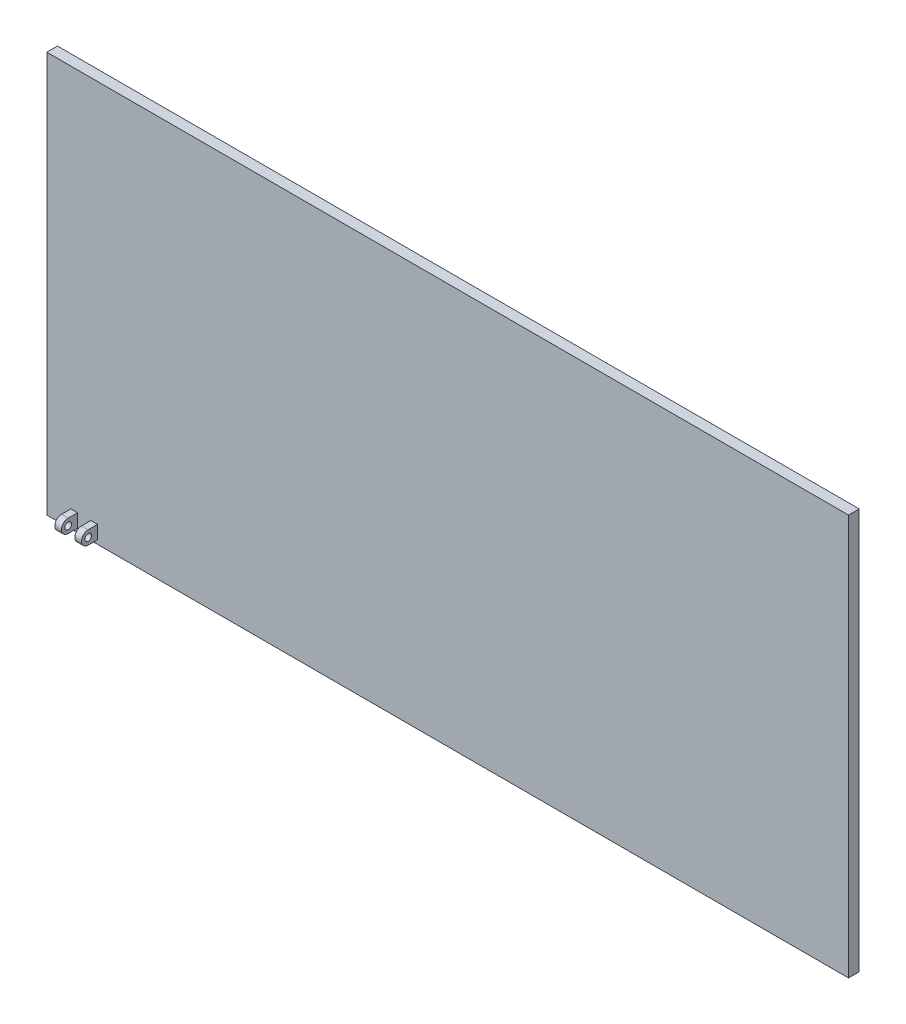
ISO-10303-21;
HEADER;
FILE_DESCRIPTION(('STEP AP214'),'2;1');
FILE_NAME('part.step','',(''),(''),'','','');
FILE_SCHEMA(('AUTOMOTIVE_DESIGN { 1 0 10303 214 1 1 1 1 }'));
ENDSEC;
DATA;
#1=APPLICATION_CONTEXT('core data for automotive mechanical design processes');
#2=APPLICATION_PROTOCOL_DEFINITION('international standard','automotive_design',2000,#1);
#3=PRODUCT_CONTEXT('',#1,'mechanical');
#4=PRODUCT('Part','Part','',(#3));
#5=PRODUCT_RELATED_PRODUCT_CATEGORY('part','',(#4));
#6=PRODUCT_DEFINITION_FORMATION('','',#4);
#7=PRODUCT_DEFINITION_CONTEXT('part definition',#1,'design');
#8=PRODUCT_DEFINITION('design','',#6,#7);
#9=PRODUCT_DEFINITION_SHAPE('','',#8);
#10=(LENGTH_UNIT() NAMED_UNIT(*) SI_UNIT(.MILLI.,.METRE.));
#11=(NAMED_UNIT(*) PLANE_ANGLE_UNIT() SI_UNIT($,.RADIAN.));
#12=(NAMED_UNIT(*) SI_UNIT($,.STERADIAN.) SOLID_ANGLE_UNIT());
#13=UNCERTAINTY_MEASURE_WITH_UNIT(LENGTH_MEASURE(1.E-05),#10,'distance_accuracy_value','');
#14=(GEOMETRIC_REPRESENTATION_CONTEXT(3) GLOBAL_UNCERTAINTY_ASSIGNED_CONTEXT((#13)) GLOBAL_UNIT_ASSIGNED_CONTEXT((#10,
#11,#12)) REPRESENTATION_CONTEXT('',''));
#15=CARTESIAN_POINT('',(0.,0.,0.));
#16=DIRECTION('',(0.,0.,1.));
#17=DIRECTION('',(1.,0.,0.));
#18=AXIS2_PLACEMENT_3D('',#15,#16,#17);
#19=CARTESIAN_POINT('',(90.,40.0000000000001,55.));
#20=DIRECTION('',(1.,0.,0.));
#21=DIRECTION('',(0.,0.,-1.));
#22=AXIS2_PLACEMENT_3D('',#19,#20,#21);
#23=CYLINDRICAL_SURFACE('',#22,25.0000000000001);
#24=CARTESIAN_POINT('',(115.,40.0000000000001,55.));
#25=DIRECTION('',(1.,0.,0.));
#26=DIRECTION('',(0.,0.,-1.));
#27=AXIS2_PLACEMENT_3D('',#24,#25,#26);
#28=CIRCLE('',#27,25.0000000000001);
#29=CARTESIAN_POINT('',(115.,65.0000000000002,55.));
#30=VERTEX_POINT('',#29);
#31=CARTESIAN_POINT('',(115.,15.,55.));
#32=VERTEX_POINT('',#31);
#33=EDGE_CURVE('E61',#30,#32,#28,.T.);
#34=ORIENTED_EDGE('',*,*,#33,.F.);
#35=DIRECTION('',(1.,0.,0.));
#36=VECTOR('',#35,1.);
#37=CARTESIAN_POINT('',(90.,65.0000000000001,55.));
#38=LINE('',#37,#36);
#39=CARTESIAN_POINT('',(90.,65.0000000000001,55.));
#40=VERTEX_POINT('',#39);
#41=EDGE_CURVE('E181',#40,#30,#38,.T.);
#42=ORIENTED_EDGE('',*,*,#41,.F.);
#43=CARTESIAN_POINT('',(90.,40.0000000000001,55.));
#44=DIRECTION('',(-1.,0.,0.));
#45=DIRECTION('',(0.,0.,-1.));
#46=AXIS2_PLACEMENT_3D('',#43,#44,#45);
#47=CIRCLE('',#46,25.0000000000001);
#48=CARTESIAN_POINT('',(90.,15.,55.));
#49=VERTEX_POINT('',#48);
#50=EDGE_CURVE('E348',#49,#40,#47,.T.);
#51=ORIENTED_EDGE('',*,*,#50,.F.);
#52=DIRECTION('',(1.,0.,0.));
#53=VECTOR('',#52,1.);
#54=CARTESIAN_POINT('',(90.,15.,55.));
#55=LINE('',#54,#53);
#56=EDGE_CURVE('E375',#49,#32,#55,.T.);
#57=ORIENTED_EDGE('',*,*,#56,.T.);
#58=EDGE_LOOP('',(#34,#42,#51,#57));
#59=FACE_BOUND('',#58,.T.);
#60=ADVANCED_FACE('F43',(#59),#23,.T.);
#61=CARTESIAN_POINT('',(90.,65.0000000000001,20.));
#62=DIRECTION('',(0.,-1.,0.));
#63=DIRECTION('',(0.,0.,-1.));
#64=AXIS2_PLACEMENT_3D('',#61,#62,#63);
#65=PLANE('',#64);
#66=DIRECTION('',(0.,0.,1.));
#67=VECTOR('',#66,1.);
#68=CARTESIAN_POINT('',(115.,65.0000000000001,20.));
#69=LINE('',#68,#67);
#70=CARTESIAN_POINT('',(115.,65.0000000000001,20.));
#71=VERTEX_POINT('',#70);
#72=EDGE_CURVE('E169',#71,#30,#69,.T.);
#73=ORIENTED_EDGE('',*,*,#72,.F.);
#74=DIRECTION('',(1.,0.,0.));
#75=VECTOR('',#74,1.);
#76=CARTESIAN_POINT('',(90.,65.0000000000001,20.));
#77=LINE('',#76,#75);
#78=CARTESIAN_POINT('',(90.,65.0000000000002,20.));
#79=VERTEX_POINT('',#78);
#80=EDGE_CURVE('E179',#79,#71,#77,.T.);
#81=ORIENTED_EDGE('',*,*,#80,.F.);
#82=DIRECTION('',(0.,0.,-1.));
#83=VECTOR('',#82,1.);
#84=CARTESIAN_POINT('',(90.,65.0000000000001,20.));
#85=LINE('',#84,#83);
#86=EDGE_CURVE('E352',#40,#79,#85,.T.);
#87=ORIENTED_EDGE('',*,*,#86,.F.);
#88=ORIENTED_EDGE('',*,*,#41,.T.);
#89=EDGE_LOOP('',(#73,#81,#87,#88));
#90=FACE_BOUND('',#89,.T.);
#91=ADVANCED_FACE('F178',(#90),#65,.F.);
#92=CARTESIAN_POINT('',(90.,15.,55.));
#93=DIRECTION('',(0.,1.,0.));
#94=DIRECTION('',(0.,0.,1.));
#95=AXIS2_PLACEMENT_3D('',#92,#93,#94);
#96=PLANE('',#95);
#97=DIRECTION('',(0.,0.,-1.));
#98=VECTOR('',#97,1.);
#99=CARTESIAN_POINT('',(115.,15.,55.));
#100=LINE('',#99,#98);
#101=CARTESIAN_POINT('',(115.,15.,20.));
#102=VERTEX_POINT('',#101);
#103=EDGE_CURVE('E170',#32,#102,#100,.T.);
#104=ORIENTED_EDGE('',*,*,#103,.F.);
#105=ORIENTED_EDGE('',*,*,#56,.F.);
#106=DIRECTION('',(0.,0.,1.));
#107=VECTOR('',#106,1.);
#108=CARTESIAN_POINT('',(90.,15.,55.));
#109=LINE('',#108,#107);
#110=CARTESIAN_POINT('',(90.,15.,20.));
#111=VERTEX_POINT('',#110);
#112=EDGE_CURVE('E358',#111,#49,#109,.T.);
#113=ORIENTED_EDGE('',*,*,#112,.F.);
#114=DIRECTION('',(1.,0.,0.));
#115=VECTOR('',#114,1.);
#116=CARTESIAN_POINT('',(90.,15.,20.));
#117=LINE('',#116,#115);
#118=EDGE_CURVE('E192',#111,#102,#117,.T.);
#119=ORIENTED_EDGE('',*,*,#118,.T.);
#120=EDGE_LOOP('',(#104,#105,#113,#119));
#121=FACE_BOUND('',#120,.T.);
#122=ADVANCED_FACE('F469',(#121),#96,.F.);
#123=CARTESIAN_POINT('',(90.,40.0000000000001,55.));
#124=DIRECTION('',(1.,0.,0.));
#125=DIRECTION('',(0.,0.,-1.));
#126=AXIS2_PLACEMENT_3D('',#123,#124,#125);
#127=CYLINDRICAL_SURFACE('',#126,12.5);
#128=CARTESIAN_POINT('',(90.,40.0000000000001,55.));
#129=DIRECTION('',(-1.,0.,0.));
#130=DIRECTION('',(0.,0.,1.));
#131=AXIS2_PLACEMENT_3D('',#128,#129,#130);
#132=CIRCLE('',#131,12.5);
#133=CARTESIAN_POINT('',(90.,40.0000000000001,42.5));
#134=VERTEX_POINT('',#133);
#135=EDGE_CURVE('E340',#134,#134,#132,.T.);
#136=CARTESIAN_POINT('',(115.,40.0000000000001,55.));
#137=DIRECTION('',(1.,0.,0.));
#138=DIRECTION('',(0.,0.,-1.));
#139=AXIS2_PLACEMENT_3D('',#136,#137,#138);
#140=CIRCLE('',#139,12.5);
#141=CARTESIAN_POINT('',(115.,40.0000000000001,42.5));
#142=VERTEX_POINT('',#141);
#143=EDGE_CURVE('E313',#142,#142,#140,.T.);
#144=CARTESIAN_POINT('',(90.,40.0000000000001,42.5));
#145=CARTESIAN_POINT('',(90.2604166666667,40.0000000000001,42.5));
#146=CARTESIAN_POINT('',(90.5208333333334,40.0000000000001,42.5));
#147=CARTESIAN_POINT('',(91.0416666666667,40.0000000000001,42.5));
#148=CARTESIAN_POINT('',(91.3020833333334,40.0000000000001,42.5));
#149=CARTESIAN_POINT('',(91.8229166666667,40.0000000000001,42.5));
#150=CARTESIAN_POINT('',(92.0833333333334,40.0000000000001,42.5));
#151=CARTESIAN_POINT('',(92.6041666666667,40.0000000000001,42.5));
#152=CARTESIAN_POINT('',(92.8645833333333,40.0000000000001,42.5));
#153=CARTESIAN_POINT('',(93.3854166666667,40.0000000000001,42.5));
#154=CARTESIAN_POINT('',(93.6458333333333,40.0000000000001,42.5));
#155=CARTESIAN_POINT('',(94.1666666666667,40.0000000000001,42.5));
#156=CARTESIAN_POINT('',(94.4270833333334,40.0000000000001,42.5));
#157=CARTESIAN_POINT('',(94.9479166666667,40.0000000000001,42.5));
#158=CARTESIAN_POINT('',(95.2083333333334,40.0000000000001,42.5));
#159=CARTESIAN_POINT('',(95.7291666666667,40.0000000000001,42.5));
#160=CARTESIAN_POINT('',(95.9895833333334,40.0000000000001,42.5));
#161=CARTESIAN_POINT('',(96.5104166666667,40.0000000000001,42.5));
#162=CARTESIAN_POINT('',(96.7708333333333,40.0000000000001,42.5));
#163=CARTESIAN_POINT('',(97.2916666666667,40.0000000000001,42.5));
#164=CARTESIAN_POINT('',(97.5520833333333,40.0000000000001,42.5));
#165=CARTESIAN_POINT('',(98.0729166666667,40.0000000000001,42.5));
#166=CARTESIAN_POINT('',(98.3333333333333,40.0000000000001,42.5));
#167=CARTESIAN_POINT('',(98.8541666666667,40.0000000000001,42.5));
#168=CARTESIAN_POINT('',(99.1145833333334,40.0000000000001,42.5));
#169=CARTESIAN_POINT('',(99.6354166666667,40.0000000000001,42.5));
#170=CARTESIAN_POINT('',(99.8958333333334,40.0000000000001,42.5));
#171=CARTESIAN_POINT('',(100.416666666667,40.0000000000001,42.5));
#172=CARTESIAN_POINT('',(100.677083333333,40.0000000000001,42.5));
#173=CARTESIAN_POINT('',(101.197916666667,40.0000000000001,42.5));
#174=CARTESIAN_POINT('',(101.458333333333,40.0000000000001,42.5));
#175=CARTESIAN_POINT('',(101.979166666667,40.0000000000001,42.5));
#176=CARTESIAN_POINT('',(102.239583333333,40.0000000000001,42.5));
#177=CARTESIAN_POINT('',(102.760416666667,40.0000000000001,42.5));
#178=CARTESIAN_POINT('',(103.020833333333,40.0000000000001,42.5));
#179=CARTESIAN_POINT('',(103.541666666667,40.0000000000001,42.5));
#180=CARTESIAN_POINT('',(103.802083333333,40.0000000000001,42.5));
#181=CARTESIAN_POINT('',(104.322916666667,40.0000000000001,42.5));
#182=CARTESIAN_POINT('',(104.583333333333,40.0000000000001,42.5));
#183=CARTESIAN_POINT('',(105.104166666667,40.0000000000001,42.5));
#184=CARTESIAN_POINT('',(105.364583333333,40.0000000000001,42.5));
#185=CARTESIAN_POINT('',(105.885416666667,40.0000000000001,42.5));
#186=CARTESIAN_POINT('',(106.145833333333,40.0000000000001,42.5));
#187=CARTESIAN_POINT('',(106.666666666667,40.0000000000001,42.5));
#188=CARTESIAN_POINT('',(106.927083333333,40.0000000000001,42.5));
#189=CARTESIAN_POINT('',(107.447916666667,40.0000000000001,42.5));
#190=CARTESIAN_POINT('',(107.708333333333,40.0000000000001,42.5));
#191=CARTESIAN_POINT('',(108.229166666667,40.0000000000001,42.5));
#192=CARTESIAN_POINT('',(108.489583333333,40.0000000000001,42.5));
#193=CARTESIAN_POINT('',(109.010416666667,40.0000000000001,42.5));
#194=CARTESIAN_POINT('',(109.270833333333,40.0000000000001,42.5));
#195=CARTESIAN_POINT('',(109.791666666667,40.0000000000001,42.5));
#196=CARTESIAN_POINT('',(110.052083333333,40.0000000000001,42.5));
#197=CARTESIAN_POINT('',(110.572916666667,40.0000000000001,42.5));
#198=CARTESIAN_POINT('',(110.833333333333,40.0000000000001,42.5));
#199=CARTESIAN_POINT('',(111.354166666667,40.0000000000001,42.5));
#200=CARTESIAN_POINT('',(111.614583333333,40.0000000000001,42.5));
#201=CARTESIAN_POINT('',(112.135416666667,40.0000000000001,42.5));
#202=CARTESIAN_POINT('',(112.395833333333,40.0000000000001,42.5));
#203=CARTESIAN_POINT('',(112.916666666667,40.0000000000001,42.5));
#204=CARTESIAN_POINT('',(113.177083333333,40.0000000000001,42.5));
#205=CARTESIAN_POINT('',(113.697916666667,40.0000000000001,42.5));
#206=CARTESIAN_POINT('',(113.958333333333,40.0000000000001,42.5));
#207=CARTESIAN_POINT('',(114.479166666667,40.0000000000001,42.5));
#208=CARTESIAN_POINT('',(114.739583333333,40.0000000000001,42.5));
#209=CARTESIAN_POINT('',(115.,40.0000000000001,42.5));
#210=B_SPLINE_CURVE_WITH_KNOTS('',3,(#144,#145,#146,#147,#148,#149,#150,#151,#152,#153,#154,
#155,#156,#157,#158,#159,#160,#161,#162,#163,#164,#165,#166,#167,#168,#169,#170,#171,#172,#173,
#174,#175,#176,#177,#178,#179,#180,#181,#182,#183,#184,#185,#186,#187,#188,#189,#190,#191,#192,
#193,#194,#195,#196,#197,#198,#199,#200,#201,#202,#203,#204,#205,#206,#207,#208,#209),
.UNSPECIFIED.,.F.,.F.,(4,2,2,2,2,2,2,2,2,2,2,2,2,2,2,2,2,2,2,2,2,2,2,2,2,2,2,2,2,2,2,2,4),(0.,
0.781250000000011,1.56250000000001,2.34375000000001,3.125,3.90625,4.68750000000001,
5.46875000000001,6.25000000000001,7.03125,7.8125,8.59375,9.37500000000001,10.15625,10.9375,
11.71875,12.5,13.28125,14.0625,14.84375,15.625,16.40625,17.1875,17.96875,18.75,19.53125,20.3125,
21.09375,21.875,22.65625,23.4375,24.21875,25.),.UNSPECIFIED.);
#211=EDGE_CURVE('BSEAM405',#134,#142,#210,.T.);
#212=ORIENTED_EDGE('',*,*,#135,.T.);
#213=ORIENTED_EDGE('',*,*,#143,.T.);
#214=ORIENTED_EDGE('',*,*,#211,.T.);
#215=ORIENTED_EDGE('',*,*,#211,.F.);
#216=EDGE_LOOP('',(#212,#214,#213,#215));
#217=FACE_BOUND('',#216,.T.);
#218=ADVANCED_FACE('F405',(#217),#127,.F.);
#219=CARTESIAN_POINT('',(0.,0.,20.));
#220=DIRECTION('',(0.,0.,-1.));
#221=DIRECTION('',(-1.,0.,0.));
#222=AXIS2_PLACEMENT_3D('',#219,#220,#221);
#223=PLANE('',#222);
#224=DIRECTION('',(0.,-1.,0.));
#225=VECTOR('',#224,1.);
#226=CARTESIAN_POINT('',(165.,0.,20.));
#227=LINE('',#226,#225);
#228=CARTESIAN_POINT('',(165.,65.0000000000001,20.));
#229=VERTEX_POINT('',#228);
#230=CARTESIAN_POINT('',(165.,15.,20.));
#231=VERTEX_POINT('',#230);
#232=EDGE_CURVE('E173',#229,#231,#227,.T.);
#233=ORIENTED_EDGE('',*,*,#232,.F.);
#234=CARTESIAN_POINT('',(190.,65.0000000000002,20.));
#235=VERTEX_POINT('',#234);
#236=EDGE_CURVE('E187',#229,#235,#77,.T.);
#237=ORIENTED_EDGE('',*,*,#236,.T.);
#238=DIRECTION('',(0.,-1.,0.));
#239=VECTOR('',#238,1.);
#240=CARTESIAN_POINT('',(190.,15.,20.));
#241=LINE('',#240,#239);
#242=CARTESIAN_POINT('',(190.,15.,20.));
#243=VERTEX_POINT('',#242);
#244=EDGE_CURVE('E369',#235,#243,#241,.T.);
#245=ORIENTED_EDGE('',*,*,#244,.T.);
#246=EDGE_CURVE('E378',#231,#243,#117,.T.);
#247=ORIENTED_EDGE('',*,*,#246,.F.);
#248=EDGE_LOOP('',(#233,#237,#245,#247));
#249=FACE_BOUND('',#248,.T.);
#250=DIRECTION('',(1.,0.,0.));
#251=VECTOR('',#250,1.);
#252=CARTESIAN_POINT('',(0.,0.,20.));
#253=LINE('',#252,#251);
#254=CARTESIAN_POINT('',(0.,0.,20.));
#255=VERTEX_POINT('',#254);
#256=CARTESIAN_POINT('',(280.,0.,20.));
#257=VERTEX_POINT('',#256);
#258=EDGE_CURVE('E270',#255,#257,#253,.T.);
#259=ORIENTED_EDGE('',*,*,#258,.T.);
#260=CARTESIAN_POINT('',(3000.,0.,20.));
#261=VERTEX_POINT('',#260);
#262=EDGE_CURVE('E268',#257,#261,#253,.T.);
#263=ORIENTED_EDGE('',*,*,#262,.T.);
#264=DIRECTION('',(0.,1.,0.));
#265=VECTOR('',#264,1.);
#266=CARTESIAN_POINT('',(3000.,0.,20.));
#267=LINE('',#266,#265);
#268=CARTESIAN_POINT('',(3000.,1500.,20.));
#269=VERTEX_POINT('',#268);
#270=EDGE_CURVE('E273',#261,#269,#267,.T.);
#271=ORIENTED_EDGE('',*,*,#270,.T.);
#272=DIRECTION('',(-1.,0.,0.));
#273=VECTOR('',#272,1.);
#274=CARTESIAN_POINT('',(0.,1500.,20.));
#275=LINE('',#274,#273);
#276=CARTESIAN_POINT('',(0.,1500.,20.));
#277=VERTEX_POINT('',#276);
#278=EDGE_CURVE('E276',#269,#277,#275,.T.);
#279=ORIENTED_EDGE('',*,*,#278,.T.);
#280=DIRECTION('',(0.,-1.,0.));
#281=VECTOR('',#280,1.);
#282=CARTESIAN_POINT('',(0.,0.,20.));
#283=LINE('',#282,#281);
#284=EDGE_CURVE('E265',#277,#255,#283,.T.);
#285=ORIENTED_EDGE('',*,*,#284,.T.);
#286=EDGE_LOOP('',(#259,#263,#271,#279,#285));
#287=FACE_BOUND('',#286,.T.);
#288=ORIENTED_EDGE('',*,*,#80,.T.);
#289=DIRECTION('',(0.,-1.,0.));
#290=VECTOR('',#289,1.);
#291=CARTESIAN_POINT('',(115.,0.,20.));
#292=LINE('',#291,#290);
#293=EDGE_CURVE('E166',#71,#102,#292,.T.);
#294=ORIENTED_EDGE('',*,*,#293,.T.);
#295=ORIENTED_EDGE('',*,*,#118,.F.);
#296=DIRECTION('',(0.,-1.,0.));
#297=VECTOR('',#296,1.);
#298=CARTESIAN_POINT('',(90.,15.,20.));
#299=LINE('',#298,#297);
#300=EDGE_CURVE('E69',#79,#111,#299,.T.);
#301=ORIENTED_EDGE('',*,*,#300,.F.);
#302=EDGE_LOOP('',(#288,#294,#295,#301));
#303=FACE_BOUND('',#302,.T.);
#304=ADVANCED_FACE('F184',(#249,#287,#303),#223,.F.);
#305=CARTESIAN_POINT('',(0.,0.,20.));
#306=DIRECTION('',(1.,0.,0.));
#307=DIRECTION('',(0.,0.,-1.));
#308=AXIS2_PLACEMENT_3D('',#305,#306,#307);
#309=PLANE('',#308);
#310=DIRECTION('',(0.,-1.,0.));
#311=VECTOR('',#310,1.);
#312=CARTESIAN_POINT('',(0.,0.,-20.));
#313=LINE('',#312,#311);
#314=CARTESIAN_POINT('',(0.,1500.,-20.));
#315=VERTEX_POINT('',#314);
#316=CARTESIAN_POINT('',(0.,34.6410161513775,-20.));
#317=VERTEX_POINT('',#316);
#318=EDGE_CURVE('E264',#315,#317,#313,.T.);
#319=ORIENTED_EDGE('',*,*,#318,.T.);
#320=DIRECTION('',(0.,-0.500000000000001,-0.866025403784438));
#321=VECTOR('',#320,1.);
#322=CARTESIAN_POINT('',(0.,34.6410161513775,-20.));
#323=LINE('',#322,#321);
#324=CARTESIAN_POINT('',(0.,-461.880215351702,-880.));
#325=VERTEX_POINT('',#324);
#326=EDGE_CURVE('E233',#317,#325,#323,.T.);
#327=ORIENTED_EDGE('',*,*,#326,.T.);
#328=DIRECTION('',(0.,-1.,0.));
#329=VECTOR('',#328,1.);
#330=CARTESIAN_POINT('',(0.,0.,-880.));
#331=LINE('',#330,#329);
#332=CARTESIAN_POINT('',(0.,-761.880215351702,-880.));
#333=VERTEX_POINT('',#332);
#334=EDGE_CURVE('E229',#325,#333,#331,.T.);
#335=ORIENTED_EDGE('',*,*,#334,.T.);
#336=DIRECTION('',(0.,0.,1.));
#337=VECTOR('',#336,1.);
#338=CARTESIAN_POINT('',(0.,-761.880215351702,0.));
#339=LINE('',#338,#337);
#340=CARTESIAN_POINT('',(0.,-761.880215351702,-830.));
#341=VERTEX_POINT('',#340);
#342=EDGE_CURVE('E215',#333,#341,#339,.T.);
#343=ORIENTED_EDGE('',*,*,#342,.T.);
#344=DIRECTION('',(0.,-1.,0.));
#345=VECTOR('',#344,1.);
#346=CARTESIAN_POINT('',(0.,0.,-830.));
#347=LINE('',#346,#345);
#348=CARTESIAN_POINT('',(0.,-490.747728811183,-830.));
#349=VERTEX_POINT('',#348);
#350=EDGE_CURVE('E240',#349,#341,#347,.T.);
#351=ORIENTED_EDGE('',*,*,#350,.F.);
#352=DIRECTION('',(0.,-0.500000000000001,-0.866025403784438));
#353=VECTOR('',#352,1.);
#354=CARTESIAN_POINT('',(0.,-8.6602540378444,5.00000000000002));
#355=LINE('',#354,#353);
#356=EDGE_CURVE('E237',#255,#349,#355,.T.);
#357=ORIENTED_EDGE('',*,*,#356,.F.);
#358=ORIENTED_EDGE('',*,*,#284,.F.);
#359=DIRECTION('',(0.,0.,-1.));
#360=VECTOR('',#359,1.);
#361=CARTESIAN_POINT('',(0.,1500.,20.));
#362=LINE('',#361,#360);
#363=EDGE_CURVE('E279',#277,#315,#362,.T.);
#364=ORIENTED_EDGE('',*,*,#363,.T.);
#365=EDGE_LOOP('',(#319,#327,#335,#343,#351,#357,#358,#364));
#366=FACE_BOUND('',#365,.T.);
#367=ADVANCED_FACE('F45',(#366),#309,.F.);
#368=CARTESIAN_POINT('',(0.,0.,20.));
#369=DIRECTION('',(0.,1.,0.));
#370=DIRECTION('',(0.,0.,1.));
#371=AXIS2_PLACEMENT_3D('',#368,#369,#370);
#372=PLANE('',#371);
#373=ORIENTED_EDGE('',*,*,#262,.F.);
#374=DIRECTION('',(0.,0.,-1.));
#375=VECTOR('',#374,1.);
#376=CARTESIAN_POINT('',(280.,0.,20.));
#377=LINE('',#376,#375);
#378=CARTESIAN_POINT('',(280.,0.,-20.));
#379=VERTEX_POINT('',#378);
#380=EDGE_CURVE('E260',#257,#379,#377,.T.);
#381=ORIENTED_EDGE('',*,*,#380,.T.);
#382=DIRECTION('',(1.,0.,0.));
#383=VECTOR('',#382,1.);
#384=CARTESIAN_POINT('',(0.,0.,-20.));
#385=LINE('',#384,#383);
#386=CARTESIAN_POINT('',(3000.,0.,-20.));
#387=VERTEX_POINT('',#386);
#388=EDGE_CURVE('E283',#379,#387,#385,.T.);
#389=ORIENTED_EDGE('',*,*,#388,.T.);
#390=DIRECTION('',(0.,0.,-1.));
#391=VECTOR('',#390,1.);
#392=CARTESIAN_POINT('',(3000.,0.,20.));
#393=LINE('',#392,#391);
#394=EDGE_CURVE('E298',#261,#387,#393,.T.);
#395=ORIENTED_EDGE('',*,*,#394,.F.);
#396=EDGE_LOOP('',(#373,#381,#389,#395));
#397=FACE_BOUND('',#396,.T.);
#398=ADVANCED_FACE('F424',(#397),#372,.F.);
#399=CARTESIAN_POINT('',(3000.,0.,20.));
#400=DIRECTION('',(-1.,0.,0.));
#401=DIRECTION('',(0.,0.,1.));
#402=AXIS2_PLACEMENT_3D('',#399,#400,#401);
#403=PLANE('',#402);
#404=DIRECTION('',(0.,1.,0.));
#405=VECTOR('',#404,1.);
#406=CARTESIAN_POINT('',(3000.,0.,-20.));
#407=LINE('',#406,#405);
#408=CARTESIAN_POINT('',(3000.,1500.,-20.));
#409=VERTEX_POINT('',#408);
#410=EDGE_CURVE('E286',#387,#409,#407,.T.);
#411=ORIENTED_EDGE('',*,*,#410,.T.);
#412=DIRECTION('',(0.,0.,-1.));
#413=VECTOR('',#412,1.);
#414=CARTESIAN_POINT('',(3000.,1500.,20.));
#415=LINE('',#414,#413);
#416=EDGE_CURVE('E294',#269,#409,#415,.T.);
#417=ORIENTED_EDGE('',*,*,#416,.F.);
#418=ORIENTED_EDGE('',*,*,#270,.F.);
#419=ORIENTED_EDGE('',*,*,#394,.T.);
#420=EDGE_LOOP('',(#411,#417,#418,#419));
#421=FACE_BOUND('',#420,.T.);
#422=ADVANCED_FACE('F430',(#421),#403,.F.);
#423=CARTESIAN_POINT('',(0.,1500.,20.));
#424=DIRECTION('',(0.,-1.,0.));
#425=DIRECTION('',(0.,0.,-1.));
#426=AXIS2_PLACEMENT_3D('',#423,#424,#425);
#427=PLANE('',#426);
#428=DIRECTION('',(-1.,0.,0.));
#429=VECTOR('',#428,1.);
#430=CARTESIAN_POINT('',(0.,1500.,-20.));
#431=LINE('',#430,#429);
#432=EDGE_CURVE('E269',#409,#315,#431,.T.);
#433=ORIENTED_EDGE('',*,*,#432,.T.);
#434=ORIENTED_EDGE('',*,*,#363,.F.);
#435=ORIENTED_EDGE('',*,*,#278,.F.);
#436=ORIENTED_EDGE('',*,*,#416,.T.);
#437=EDGE_LOOP('',(#433,#434,#435,#436));
#438=FACE_BOUND('',#437,.T.);
#439=ADVANCED_FACE('F434',(#438),#427,.F.);
#440=CARTESIAN_POINT('',(0.,0.,-20.));
#441=DIRECTION('',(0.,0.,-1.));
#442=DIRECTION('',(-1.,0.,0.));
#443=AXIS2_PLACEMENT_3D('',#440,#441,#442);
#444=PLANE('',#443);
#445=DIRECTION('',(1.,0.,0.));
#446=VECTOR('',#445,1.);
#447=CARTESIAN_POINT('',(0.,34.6410161513775,-20.));
#448=LINE('',#447,#446);
#449=CARTESIAN_POINT('',(280.,34.6410161513775,-20.));
#450=VERTEX_POINT('',#449);
#451=EDGE_CURVE('E11',#317,#450,#448,.T.);
#452=ORIENTED_EDGE('',*,*,#451,.F.);
#453=ORIENTED_EDGE('',*,*,#318,.F.);
#454=ORIENTED_EDGE('',*,*,#432,.F.);
#455=ORIENTED_EDGE('',*,*,#410,.F.);
#456=ORIENTED_EDGE('',*,*,#388,.F.);
#457=DIRECTION('',(0.,-1.,0.));
#458=VECTOR('',#457,1.);
#459=CARTESIAN_POINT('',(280.,0.,-20.));
#460=LINE('',#459,#458);
#461=EDGE_CURVE('E53',#450,#379,#460,.T.);
#462=ORIENTED_EDGE('',*,*,#461,.F.);
#463=EDGE_LOOP('',(#452,#453,#454,#455,#456,#462));
#464=FACE_BOUND('',#463,.T.);
#465=ADVANCED_FACE('F455',(#464),#444,.T.);
#466=CARTESIAN_POINT('',(280.,0.,0.));
#467=DIRECTION('',(1.,0.,0.));
#468=DIRECTION('',(0.,0.,-1.));
#469=AXIS2_PLACEMENT_3D('',#466,#467,#468);
#470=PLANE('',#469);
#471=ORIENTED_EDGE('',*,*,#380,.F.);
#472=DIRECTION('',(0.,-0.500000000000001,-0.866025403784438));
#473=VECTOR('',#472,1.);
#474=CARTESIAN_POINT('',(280.,-8.6602540378444,5.00000000000002));
#475=LINE('',#474,#473);
#476=CARTESIAN_POINT('',(280.,-490.747728811183,-830.));
#477=VERTEX_POINT('',#476);
#478=EDGE_CURVE('E218',#257,#477,#475,.T.);
#479=ORIENTED_EDGE('',*,*,#478,.T.);
#480=DIRECTION('',(0.,-1.,0.));
#481=VECTOR('',#480,1.);
#482=CARTESIAN_POINT('',(280.,0.,-830.));
#483=LINE('',#482,#481);
#484=CARTESIAN_POINT('',(280.,-761.880215351702,-830.));
#485=VERTEX_POINT('',#484);
#486=EDGE_CURVE('E221',#477,#485,#483,.T.);
#487=ORIENTED_EDGE('',*,*,#486,.T.);
#488=DIRECTION('',(0.,0.,1.));
#489=VECTOR('',#488,1.);
#490=CARTESIAN_POINT('',(280.,-761.880215351702,0.));
#491=LINE('',#490,#489);
#492=CARTESIAN_POINT('',(280.,-761.880215351702,-880.));
#493=VERTEX_POINT('',#492);
#494=EDGE_CURVE('E224',#493,#485,#491,.T.);
#495=ORIENTED_EDGE('',*,*,#494,.F.);
#496=DIRECTION('',(0.,-1.,0.));
#497=VECTOR('',#496,1.);
#498=CARTESIAN_POINT('',(280.,0.,-880.));
#499=LINE('',#498,#497);
#500=CARTESIAN_POINT('',(280.,-461.880215351702,-880.));
#501=VERTEX_POINT('',#500);
#502=EDGE_CURVE('E210',#501,#493,#499,.T.);
#503=ORIENTED_EDGE('',*,*,#502,.F.);
#504=DIRECTION('',(0.,-0.500000000000001,-0.866025403784438));
#505=VECTOR('',#504,1.);
#506=CARTESIAN_POINT('',(280.,34.6410161513775,-20.));
#507=LINE('',#506,#505);
#508=EDGE_CURVE('E214',#450,#501,#507,.T.);
#509=ORIENTED_EDGE('',*,*,#508,.F.);
#510=ORIENTED_EDGE('',*,*,#461,.T.);
#511=EDGE_LOOP('',(#471,#479,#487,#495,#503,#509,#510));
#512=FACE_BOUND('',#511,.T.);
#513=ADVANCED_FACE('F416',(#512),#470,.T.);
#514=CARTESIAN_POINT('',(280.,0.,-880.));
#515=DIRECTION('',(0.,0.,-1.));
#516=DIRECTION('',(-1.,0.,0.));
#517=AXIS2_PLACEMENT_3D('',#514,#515,#516);
#518=PLANE('',#517);
#519=CARTESIAN_POINT('',(140.,-563.577557423079,-880.));
#520=DIRECTION('',(0.,0.,-1.));
#521=DIRECTION('',(-1.,0.,0.));
#522=AXIS2_PLACEMENT_3D('',#519,#520,#521);
#523=CIRCLE('',#522,13.37);
#524=CARTESIAN_POINT('',(126.63,-563.577557423079,-880.));
#525=VERTEX_POINT('',#524);
#526=EDGE_CURVE('E198',#525,#525,#523,.T.);
#527=ORIENTED_EDGE('',*,*,#526,.F.);
#528=EDGE_LOOP('',(#527));
#529=FACE_BOUND('',#528,.T.);
#530=CARTESIAN_POINT('',(68.1686711634998,-687.993068543078,-880.));
#531=DIRECTION('',(0.,0.,-1.));
#532=DIRECTION('',(-1.,0.,0.));
#533=AXIS2_PLACEMENT_3D('',#530,#531,#532);
#534=CIRCLE('',#533,13.3700000000001);
#535=CARTESIAN_POINT('',(54.7986711634997,-687.993068543078,-880.));
#536=VERTEX_POINT('',#535);
#537=EDGE_CURVE('E203',#536,#536,#534,.T.);
#538=ORIENTED_EDGE('',*,*,#537,.F.);
#539=EDGE_LOOP('',(#538));
#540=FACE_BOUND('',#539,.T.);
#541=CARTESIAN_POINT('',(211.831328836494,-687.993068543081,-880.));
#542=DIRECTION('',(0.,0.,-1.));
#543=DIRECTION('',(-1.,0.,0.));
#544=AXIS2_PLACEMENT_3D('',#541,#542,#543);
#545=CIRCLE('',#544,13.37);
#546=CARTESIAN_POINT('',(198.461328836494,-687.993068543081,-880.));
#547=VERTEX_POINT('',#546);
#548=EDGE_CURVE('E197',#547,#547,#545,.T.);
#549=ORIENTED_EDGE('',*,*,#548,.F.);
#550=EDGE_LOOP('',(#549));
#551=FACE_BOUND('',#550,.T.);
#552=ORIENTED_EDGE('',*,*,#334,.F.);
#553=DIRECTION('',(-1.,0.,0.));
#554=VECTOR('',#553,1.);
#555=CARTESIAN_POINT('',(280.,-461.880215351702,-880.));
#556=LINE('',#555,#554);
#557=EDGE_CURVE('E256',#501,#325,#556,.T.);
#558=ORIENTED_EDGE('',*,*,#557,.F.);
#559=ORIENTED_EDGE('',*,*,#502,.T.);
#560=DIRECTION('',(-1.,0.,0.));
#561=VECTOR('',#560,1.);
#562=CARTESIAN_POINT('',(280.,-761.880215351702,-880.));
#563=LINE('',#562,#561);
#564=EDGE_CURVE('E228',#493,#333,#563,.T.);
#565=ORIENTED_EDGE('',*,*,#564,.T.);
#566=EDGE_LOOP('',(#552,#558,#559,#565));
#567=FACE_BOUND('',#566,.T.);
#568=ADVANCED_FACE('F450',(#529,#540,#551,#567),#518,.T.);
#569=CARTESIAN_POINT('',(280.,34.6410161513775,-20.));
#570=DIRECTION('',(0.,0.866025403784438,-0.500000000000001));
#571=DIRECTION('',(0.,0.500000000000001,0.866025403784438));
#572=AXIS2_PLACEMENT_3D('',#569,#570,#571);
#573=PLANE('',#572);
#574=ORIENTED_EDGE('',*,*,#326,.F.);
#575=ORIENTED_EDGE('',*,*,#451,.T.);
#576=ORIENTED_EDGE('',*,*,#508,.T.);
#577=ORIENTED_EDGE('',*,*,#557,.T.);
#578=EDGE_LOOP('',(#574,#575,#576,#577));
#579=FACE_BOUND('',#578,.T.);
#580=ADVANCED_FACE('F452',(#579),#573,.T.);
#581=CARTESIAN_POINT('',(280.,-8.6602540378444,5.00000000000002));
#582=DIRECTION('',(0.,0.866025403784438,-0.500000000000001));
#583=DIRECTION('',(0.,0.500000000000001,0.866025403784438));
#584=AXIS2_PLACEMENT_3D('',#581,#582,#583);
#585=PLANE('',#584);
#586=ORIENTED_EDGE('',*,*,#356,.T.);
#587=DIRECTION('',(-1.,0.,0.));
#588=VECTOR('',#587,1.);
#589=CARTESIAN_POINT('',(280.,-490.747728811183,-830.));
#590=LINE('',#589,#588);
#591=EDGE_CURVE('E252',#477,#349,#590,.T.);
#592=ORIENTED_EDGE('',*,*,#591,.F.);
#593=ORIENTED_EDGE('',*,*,#478,.F.);
#594=ORIENTED_EDGE('',*,*,#258,.F.);
#595=EDGE_LOOP('',(#586,#592,#593,#594));
#596=FACE_BOUND('',#595,.T.);
#597=ADVANCED_FACE('F422',(#596),#585,.F.);
#598=CARTESIAN_POINT('',(280.,0.,-830.));
#599=DIRECTION('',(0.,0.,-1.));
#600=DIRECTION('',(-1.,0.,0.));
#601=AXIS2_PLACEMENT_3D('',#598,#599,#600);
#602=PLANE('',#601);
#603=CARTESIAN_POINT('',(140.,-563.577557423079,-830.));
#604=DIRECTION('',(0.,0.,-1.));
#605=DIRECTION('',(-1.,0.,0.));
#606=AXIS2_PLACEMENT_3D('',#603,#604,#605);
#607=CIRCLE('',#606,13.37);
#608=CARTESIAN_POINT('',(126.63,-563.577557423079,-830.));
#609=VERTEX_POINT('',#608);
#610=EDGE_CURVE('E234',#609,#609,#607,.T.);
#611=ORIENTED_EDGE('',*,*,#610,.T.);
#612=EDGE_LOOP('',(#611));
#613=FACE_BOUND('',#612,.T.);
#614=CARTESIAN_POINT('',(68.1686711634998,-687.993068543078,-830.));
#615=DIRECTION('',(0.,0.,-1.));
#616=DIRECTION('',(-1.,0.,0.));
#617=AXIS2_PLACEMENT_3D('',#614,#615,#616);
#618=CIRCLE('',#617,13.3700000000001);
#619=CARTESIAN_POINT('',(54.7986711634997,-687.993068543078,-830.));
#620=VERTEX_POINT('',#619);
#621=EDGE_CURVE('E307',#620,#620,#618,.T.);
#622=ORIENTED_EDGE('',*,*,#621,.T.);
#623=EDGE_LOOP('',(#622));
#624=FACE_BOUND('',#623,.T.);
#625=CARTESIAN_POINT('',(211.831328836494,-687.993068543081,-830.));
#626=DIRECTION('',(0.,0.,-1.));
#627=DIRECTION('',(-1.,0.,0.));
#628=AXIS2_PLACEMENT_3D('',#625,#626,#627);
#629=CIRCLE('',#628,13.37);
#630=CARTESIAN_POINT('',(198.461328836494,-687.993068543081,-830.));
#631=VERTEX_POINT('',#630);
#632=EDGE_CURVE('E202',#631,#631,#629,.T.);
#633=ORIENTED_EDGE('',*,*,#632,.T.);
#634=EDGE_LOOP('',(#633));
#635=FACE_BOUND('',#634,.T.);
#636=ORIENTED_EDGE('',*,*,#350,.T.);
#637=DIRECTION('',(-1.,0.,0.));
#638=VECTOR('',#637,1.);
#639=CARTESIAN_POINT('',(280.,-761.880215351702,-830.));
#640=LINE('',#639,#638);
#641=EDGE_CURVE('E249',#485,#341,#640,.T.);
#642=ORIENTED_EDGE('',*,*,#641,.F.);
#643=ORIENTED_EDGE('',*,*,#486,.F.);
#644=ORIENTED_EDGE('',*,*,#591,.T.);
#645=EDGE_LOOP('',(#636,#642,#643,#644));
#646=FACE_BOUND('',#645,.T.);
#647=ADVANCED_FACE('F440',(#613,#624,#635,#646),#602,.F.);
#648=CARTESIAN_POINT('',(280.,-761.880215351702,0.));
#649=DIRECTION('',(0.,-1.,0.));
#650=DIRECTION('',(0.,0.,-1.));
#651=AXIS2_PLACEMENT_3D('',#648,#649,#650);
#652=PLANE('',#651);
#653=ORIENTED_EDGE('',*,*,#342,.F.);
#654=ORIENTED_EDGE('',*,*,#564,.F.);
#655=ORIENTED_EDGE('',*,*,#494,.T.);
#656=ORIENTED_EDGE('',*,*,#641,.T.);
#657=EDGE_LOOP('',(#653,#654,#655,#656));
#658=FACE_BOUND('',#657,.T.);
#659=ADVANCED_FACE('F446',(#658),#652,.T.);
#660=CARTESIAN_POINT('',(211.831328836494,-687.993068543081,20.));
#661=DIRECTION('',(0.,0.,-1.));
#662=DIRECTION('',(-1.,0.,0.));
#663=AXIS2_PLACEMENT_3D('',#660,#661,#662);
#664=CYLINDRICAL_SURFACE('',#663,13.37);
#665=ORIENTED_EDGE('',*,*,#548,.T.);
#666=EDGE_LOOP('',(#665));
#667=FACE_BOUND('',#666,.T.);
#668=ORIENTED_EDGE('',*,*,#632,.F.);
#669=EDGE_LOOP('',(#668));
#670=FACE_BOUND('',#669,.T.);
#671=ADVANCED_FACE('F597',(#667,#670),#664,.F.);
#672=CARTESIAN_POINT('',(68.1686711634998,-687.993068543078,20.));
#673=DIRECTION('',(0.,0.,-1.));
#674=DIRECTION('',(-1.,0.,0.));
#675=AXIS2_PLACEMENT_3D('',#672,#673,#674);
#676=CYLINDRICAL_SURFACE('',#675,13.3700000000001);
#677=ORIENTED_EDGE('',*,*,#537,.T.);
#678=EDGE_LOOP('',(#677));
#679=FACE_BOUND('',#678,.T.);
#680=ORIENTED_EDGE('',*,*,#621,.F.);
#681=EDGE_LOOP('',(#680));
#682=FACE_BOUND('',#681,.T.);
#683=ADVANCED_FACE('F588',(#679,#682),#676,.F.);
#684=CARTESIAN_POINT('',(140.,-563.577557423079,20.));
#685=DIRECTION('',(0.,0.,-1.));
#686=DIRECTION('',(-1.,0.,0.));
#687=AXIS2_PLACEMENT_3D('',#684,#685,#686);
#688=CYLINDRICAL_SURFACE('',#687,13.37);
#689=ORIENTED_EDGE('',*,*,#526,.T.);
#690=EDGE_LOOP('',(#689));
#691=FACE_BOUND('',#690,.T.);
#692=ORIENTED_EDGE('',*,*,#610,.F.);
#693=EDGE_LOOP('',(#692));
#694=FACE_BOUND('',#693,.T.);
#695=ADVANCED_FACE('F482',(#691,#694),#688,.F.);
#696=CARTESIAN_POINT('',(90.,40.0000000000001,55.));
#697=DIRECTION('',(1.,0.,0.));
#698=DIRECTION('',(0.,0.,-1.));
#699=AXIS2_PLACEMENT_3D('',#696,#697,#698);
#700=PLANE('',#699);
#701=ORIENTED_EDGE('',*,*,#50,.T.);
#702=ORIENTED_EDGE('',*,*,#86,.T.);
#703=ORIENTED_EDGE('',*,*,#300,.T.);
#704=ORIENTED_EDGE('',*,*,#112,.T.);
#705=EDGE_LOOP('',(#701,#702,#703,#704));
#706=FACE_BOUND('',#705,.T.);
#707=ORIENTED_EDGE('',*,*,#135,.F.);
#708=EDGE_LOOP('',(#707));
#709=FACE_BOUND('',#708,.T.);
#710=ADVANCED_FACE('F477',(#706,#709),#700,.F.);
#711=CARTESIAN_POINT('',(190.,40.0000000000001,55.));
#712=DIRECTION('',(1.,0.,0.));
#713=DIRECTION('',(0.,0.,-1.));
#714=AXIS2_PLACEMENT_3D('',#711,#712,#713);
#715=PLANE('',#714);
#716=CARTESIAN_POINT('',(190.,40.0000000000001,55.));
#717=DIRECTION('',(-1.,0.,0.));
#718=DIRECTION('',(0.,0.,-1.));
#719=AXIS2_PLACEMENT_3D('',#716,#717,#718);
#720=CIRCLE('',#719,25.0000000000001);
#721=CARTESIAN_POINT('',(190.,15.,55.));
#722=VERTEX_POINT('',#721);
#723=CARTESIAN_POINT('',(190.,65.0000000000001,55.));
#724=VERTEX_POINT('',#723);
#725=EDGE_CURVE('E344',#722,#724,#720,.T.);
#726=ORIENTED_EDGE('',*,*,#725,.F.);
#727=DIRECTION('',(0.,0.,1.));
#728=VECTOR('',#727,1.);
#729=CARTESIAN_POINT('',(190.,15.,55.));
#730=LINE('',#729,#728);
#731=EDGE_CURVE('E353',#243,#722,#730,.T.);
#732=ORIENTED_EDGE('',*,*,#731,.F.);
#733=ORIENTED_EDGE('',*,*,#244,.F.);
#734=DIRECTION('',(0.,0.,-1.));
#735=VECTOR('',#734,1.);
#736=CARTESIAN_POINT('',(190.,65.0000000000001,20.));
#737=LINE('',#736,#735);
#738=EDGE_CURVE('E365',#724,#235,#737,.T.);
#739=ORIENTED_EDGE('',*,*,#738,.F.);
#740=EDGE_LOOP('',(#726,#732,#733,#739));
#741=FACE_BOUND('',#740,.T.);
#742=CARTESIAN_POINT('',(190.,40.0000000000001,55.));
#743=DIRECTION('',(-1.,0.,0.));
#744=DIRECTION('',(0.,0.,1.));
#745=AXIS2_PLACEMENT_3D('',#742,#743,#744);
#746=CIRCLE('',#745,12.5);
#747=CARTESIAN_POINT('',(190.,40.0000000000001,42.5));
#748=VERTEX_POINT('',#747);
#749=EDGE_CURVE('E339',#748,#748,#746,.T.);
#750=ORIENTED_EDGE('',*,*,#749,.T.);
#751=EDGE_LOOP('',(#750));
#752=FACE_BOUND('',#751,.T.);
#753=ADVANCED_FACE('F396',(#741,#752),#715,.T.);
#754=CARTESIAN_POINT('',(165.,65.0000000000002,55.));
#755=VERTEX_POINT('',#754);
#756=EDGE_CURVE('E186',#755,#724,#38,.T.);
#757=ORIENTED_EDGE('',*,*,#756,.F.);
#758=CARTESIAN_POINT('',(165.,40.0000000000001,55.));
#759=DIRECTION('',(1.,0.,0.));
#760=DIRECTION('',(0.,0.,-1.));
#761=AXIS2_PLACEMENT_3D('',#758,#759,#760);
#762=CIRCLE('',#761,25.0000000000001);
#763=CARTESIAN_POINT('',(165.,15.,55.));
#764=VERTEX_POINT('',#763);
#765=EDGE_CURVE('E331',#755,#764,#762,.T.);
#766=ORIENTED_EDGE('',*,*,#765,.T.);
#767=EDGE_CURVE('E361',#764,#722,#55,.T.);
#768=ORIENTED_EDGE('',*,*,#767,.T.);
#769=ORIENTED_EDGE('',*,*,#725,.T.);
#770=EDGE_LOOP('',(#757,#766,#768,#769));
#771=FACE_BOUND('',#770,.T.);
#772=ADVANCED_FACE('F387',(#771),#23,.T.);
#773=ORIENTED_EDGE('',*,*,#236,.F.);
#774=DIRECTION('',(0.,0.,1.));
#775=VECTOR('',#774,1.);
#776=CARTESIAN_POINT('',(165.,65.0000000000001,20.));
#777=LINE('',#776,#775);
#778=EDGE_CURVE('E335',#229,#755,#777,.T.);
#779=ORIENTED_EDGE('',*,*,#778,.T.);
#780=ORIENTED_EDGE('',*,*,#756,.T.);
#781=ORIENTED_EDGE('',*,*,#738,.T.);
#782=EDGE_LOOP('',(#773,#779,#780,#781));
#783=FACE_BOUND('',#782,.T.);
#784=ADVANCED_FACE('F400',(#783),#65,.F.);
#785=ORIENTED_EDGE('',*,*,#767,.F.);
#786=DIRECTION('',(0.,0.,-1.));
#787=VECTOR('',#786,1.);
#788=CARTESIAN_POINT('',(165.,15.,55.));
#789=LINE('',#788,#787);
#790=EDGE_CURVE('E328',#764,#231,#789,.T.);
#791=ORIENTED_EDGE('',*,*,#790,.T.);
#792=ORIENTED_EDGE('',*,*,#246,.T.);
#793=ORIENTED_EDGE('',*,*,#731,.T.);
#794=EDGE_LOOP('',(#785,#791,#792,#793));
#795=FACE_BOUND('',#794,.T.);
#796=ADVANCED_FACE('F391',(#795),#96,.F.);
#797=CARTESIAN_POINT('',(165.,40.0000000000001,55.));
#798=DIRECTION('',(1.,0.,0.));
#799=DIRECTION('',(0.,0.,-1.));
#800=AXIS2_PLACEMENT_3D('',#797,#798,#799);
#801=CIRCLE('',#800,12.5);
#802=CARTESIAN_POINT('',(165.,40.0000000000001,42.5));
#803=VERTEX_POINT('',#802);
#804=EDGE_CURVE('E47',#803,#803,#801,.T.);
#805=CARTESIAN_POINT('',(165.,40.0000000000001,42.5));
#806=CARTESIAN_POINT('',(165.260416666667,40.0000000000001,42.5));
#807=CARTESIAN_POINT('',(165.520833333333,40.0000000000001,42.5));
#808=CARTESIAN_POINT('',(166.041666666667,40.0000000000001,42.5));
#809=CARTESIAN_POINT('',(166.302083333333,40.0000000000001,42.5));
#810=CARTESIAN_POINT('',(166.822916666667,40.0000000000001,42.5));
#811=CARTESIAN_POINT('',(167.083333333333,40.0000000000001,42.5));
#812=CARTESIAN_POINT('',(167.604166666667,40.0000000000001,42.5));
#813=CARTESIAN_POINT('',(167.864583333333,40.0000000000001,42.5));
#814=CARTESIAN_POINT('',(168.385416666667,40.0000000000001,42.5));
#815=CARTESIAN_POINT('',(168.645833333333,40.0000000000001,42.5));
#816=CARTESIAN_POINT('',(169.166666666667,40.0000000000001,42.5));
#817=CARTESIAN_POINT('',(169.427083333333,40.0000000000001,42.5));
#818=CARTESIAN_POINT('',(169.947916666667,40.0000000000001,42.5));
#819=CARTESIAN_POINT('',(170.208333333333,40.0000000000001,42.5));
#820=CARTESIAN_POINT('',(170.729166666667,40.0000000000001,42.5));
#821=CARTESIAN_POINT('',(170.989583333333,40.0000000000001,42.5));
#822=CARTESIAN_POINT('',(171.510416666667,40.0000000000001,42.5));
#823=CARTESIAN_POINT('',(171.770833333333,40.0000000000001,42.5));
#824=CARTESIAN_POINT('',(172.291666666667,40.0000000000001,42.5));
#825=CARTESIAN_POINT('',(172.552083333333,40.0000000000001,42.5));
#826=CARTESIAN_POINT('',(173.072916666667,40.0000000000001,42.5));
#827=CARTESIAN_POINT('',(173.333333333333,40.0000000000001,42.5));
#828=CARTESIAN_POINT('',(173.854166666667,40.0000000000001,42.5));
#829=CARTESIAN_POINT('',(174.114583333333,40.0000000000001,42.5));
#830=CARTESIAN_POINT('',(174.635416666667,40.0000000000001,42.5));
#831=CARTESIAN_POINT('',(174.895833333333,40.0000000000001,42.5));
#832=CARTESIAN_POINT('',(175.416666666667,40.0000000000001,42.5));
#833=CARTESIAN_POINT('',(175.677083333333,40.0000000000001,42.5));
#834=CARTESIAN_POINT('',(176.197916666667,40.0000000000001,42.5));
#835=CARTESIAN_POINT('',(176.458333333333,40.0000000000001,42.5));
#836=CARTESIAN_POINT('',(176.979166666667,40.0000000000001,42.5));
#837=CARTESIAN_POINT('',(177.239583333333,40.0000000000001,42.5));
#838=CARTESIAN_POINT('',(177.760416666667,40.0000000000001,42.5));
#839=CARTESIAN_POINT('',(178.020833333333,40.0000000000001,42.5));
#840=CARTESIAN_POINT('',(178.541666666667,40.0000000000001,42.5));
#841=CARTESIAN_POINT('',(178.802083333333,40.0000000000001,42.5));
#842=CARTESIAN_POINT('',(179.322916666667,40.0000000000001,42.5));
#843=CARTESIAN_POINT('',(179.583333333333,40.0000000000001,42.5));
#844=CARTESIAN_POINT('',(180.104166666667,40.0000000000001,42.5));
#845=CARTESIAN_POINT('',(180.364583333333,40.0000000000001,42.5));
#846=CARTESIAN_POINT('',(180.885416666667,40.0000000000001,42.5));
#847=CARTESIAN_POINT('',(181.145833333333,40.0000000000001,42.5));
#848=CARTESIAN_POINT('',(181.666666666667,40.0000000000001,42.5));
#849=CARTESIAN_POINT('',(181.927083333333,40.0000000000001,42.5));
#850=CARTESIAN_POINT('',(182.447916666667,40.0000000000001,42.5));
#851=CARTESIAN_POINT('',(182.708333333333,40.0000000000001,42.5));
#852=CARTESIAN_POINT('',(183.229166666667,40.0000000000001,42.5));
#853=CARTESIAN_POINT('',(183.489583333333,40.0000000000001,42.5));
#854=CARTESIAN_POINT('',(184.010416666667,40.0000000000001,42.5));
#855=CARTESIAN_POINT('',(184.270833333333,40.0000000000001,42.5));
#856=CARTESIAN_POINT('',(184.791666666667,40.0000000000001,42.5));
#857=CARTESIAN_POINT('',(185.052083333333,40.0000000000001,42.5));
#858=CARTESIAN_POINT('',(185.572916666667,40.0000000000001,42.5));
#859=CARTESIAN_POINT('',(185.833333333333,40.0000000000001,42.5));
#860=CARTESIAN_POINT('',(186.354166666667,40.0000000000001,42.5));
#861=CARTESIAN_POINT('',(186.614583333333,40.0000000000001,42.5));
#862=CARTESIAN_POINT('',(187.135416666667,40.0000000000001,42.5));
#863=CARTESIAN_POINT('',(187.395833333333,40.0000000000001,42.5));
#864=CARTESIAN_POINT('',(187.916666666667,40.0000000000001,42.5));
#865=CARTESIAN_POINT('',(188.177083333333,40.0000000000001,42.5));
#866=CARTESIAN_POINT('',(188.697916666667,40.0000000000001,42.5));
#867=CARTESIAN_POINT('',(188.958333333333,40.0000000000001,42.5));
#868=CARTESIAN_POINT('',(189.479166666667,40.0000000000001,42.5));
#869=CARTESIAN_POINT('',(189.739583333333,40.0000000000001,42.5));
#870=CARTESIAN_POINT('',(190.,40.0000000000001,42.5));
#871=B_SPLINE_CURVE_WITH_KNOTS('',3,(#805,#806,#807,#808,#809,#810,#811,#812,#813,#814,#815,
#816,#817,#818,#819,#820,#821,#822,#823,#824,#825,#826,#827,#828,#829,#830,#831,#832,#833,#834,
#835,#836,#837,#838,#839,#840,#841,#842,#843,#844,#845,#846,#847,#848,#849,#850,#851,#852,#853,
#854,#855,#856,#857,#858,#859,#860,#861,#862,#863,#864,#865,#866,#867,#868,#869,#870),
.UNSPECIFIED.,.F.,.F.,(4,2,2,2,2,2,2,2,2,2,2,2,2,2,2,2,2,2,2,2,2,2,2,2,2,2,2,2,2,2,2,2,4),(0.,
0.781249999999983,1.56249999999999,2.34375000000001,3.12500000000002,3.90625,4.68750000000001,
5.46874999999999,6.25000000000001,7.03125000000002,7.8125,8.59375000000001,9.37499999999999,
10.15625,10.9375,11.71875,12.5,13.28125,14.0625,14.84375,15.625,16.40625,17.1875,17.96875,18.75,
19.53125,20.3125,21.09375,21.875,22.65625,23.4375,24.21875,25.),.UNSPECIFIED.);
#872=EDGE_CURVE('BSEAM488',#803,#748,#871,.T.);
#873=ORIENTED_EDGE('',*,*,#804,.F.);
#874=ORIENTED_EDGE('',*,*,#749,.F.);
#875=ORIENTED_EDGE('',*,*,#872,.T.);
#876=ORIENTED_EDGE('',*,*,#872,.F.);
#877=EDGE_LOOP('',(#873,#875,#874,#876));
#878=FACE_BOUND('',#877,.T.);
#879=ADVANCED_FACE('F488',(#878),#127,.F.);
#880=CARTESIAN_POINT('',(165.,0.,0.));
#881=DIRECTION('',(1.,0.,0.));
#882=DIRECTION('',(0.,0.,-1.));
#883=AXIS2_PLACEMENT_3D('',#880,#881,#882);
#884=PLANE('',#883);
#885=ORIENTED_EDGE('',*,*,#804,.T.);
#886=EDGE_LOOP('',(#885));
#887=FACE_BOUND('',#886,.T.);
#888=ORIENTED_EDGE('',*,*,#232,.T.);
#889=ORIENTED_EDGE('',*,*,#790,.F.);
#890=ORIENTED_EDGE('',*,*,#765,.F.);
#891=ORIENTED_EDGE('',*,*,#778,.F.);
#892=EDGE_LOOP('',(#888,#889,#890,#891));
#893=FACE_BOUND('',#892,.T.);
#894=ADVANCED_FACE('F401',(#887,#893),#884,.F.);
#895=CARTESIAN_POINT('',(115.,0.,0.));
#896=DIRECTION('',(1.,0.,0.));
#897=DIRECTION('',(0.,0.,-1.));
#898=AXIS2_PLACEMENT_3D('',#895,#896,#897);
#899=PLANE('',#898);
#900=ORIENTED_EDGE('',*,*,#143,.F.);
#901=EDGE_LOOP('',(#900));
#902=FACE_BOUND('',#901,.T.);
#903=ORIENTED_EDGE('',*,*,#72,.T.);
#904=ORIENTED_EDGE('',*,*,#33,.T.);
#905=ORIENTED_EDGE('',*,*,#103,.T.);
#906=ORIENTED_EDGE('',*,*,#293,.F.);
#907=EDGE_LOOP('',(#903,#904,#905,#906));
#908=FACE_BOUND('',#907,.T.);
#909=ADVANCED_FACE('F168',(#902,#908),#899,.T.);
#910=CLOSED_SHELL('',(#60,#91,#122,#218,#304,#367,#398,#422,#439,#465,#513,#568,#580,#597,#647,
#659,#671,#683,#695,#710,#753,#772,#784,#796,#879,#894,#909));
#911=MANIFOLD_SOLID_BREP('B2',#910);
#912=ADVANCED_BREP_SHAPE_REPRESENTATION('',(#18,#911),#14);
#913=SHAPE_DEFINITION_REPRESENTATION(#9,#912);
ENDSEC;
END-ISO-10303-21;
